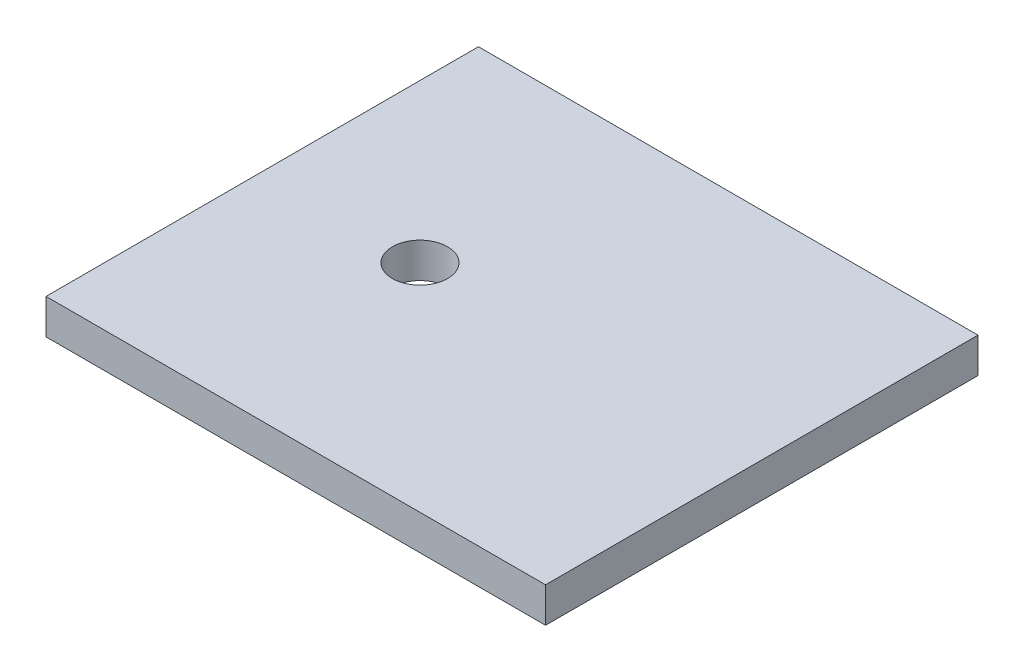
ISO-10303-21;
HEADER;
FILE_DESCRIPTION(('STEP AP214'),'2;1');
FILE_NAME('part.step','',(''),(''),'','','');
FILE_SCHEMA(('AUTOMOTIVE_DESIGN { 1 0 10303 214 1 1 1 1 }'));
ENDSEC;
DATA;
#1=APPLICATION_CONTEXT('core data for automotive mechanical design processes');
#2=APPLICATION_PROTOCOL_DEFINITION('international standard','automotive_design',2000,#1);
#3=PRODUCT_CONTEXT('',#1,'mechanical');
#4=PRODUCT('Part','Part','',(#3));
#5=PRODUCT_RELATED_PRODUCT_CATEGORY('part','',(#4));
#6=PRODUCT_DEFINITION_FORMATION('','',#4);
#7=PRODUCT_DEFINITION_CONTEXT('part definition',#1,'design');
#8=PRODUCT_DEFINITION('design','',#6,#7);
#9=PRODUCT_DEFINITION_SHAPE('','',#8);
#10=(LENGTH_UNIT() NAMED_UNIT(*) SI_UNIT(.MILLI.,.METRE.));
#11=(NAMED_UNIT(*) PLANE_ANGLE_UNIT() SI_UNIT($,.RADIAN.));
#12=(NAMED_UNIT(*) SI_UNIT($,.STERADIAN.) SOLID_ANGLE_UNIT());
#13=UNCERTAINTY_MEASURE_WITH_UNIT(LENGTH_MEASURE(1.E-05),#10,'distance_accuracy_value','');
#14=(GEOMETRIC_REPRESENTATION_CONTEXT(3) GLOBAL_UNCERTAINTY_ASSIGNED_CONTEXT((#13)) GLOBAL_UNIT_ASSIGNED_CONTEXT((#10,
#11,#12)) REPRESENTATION_CONTEXT('',''));
#15=CARTESIAN_POINT('',(0.,0.,0.));
#16=DIRECTION('',(0.,0.,1.));
#17=DIRECTION('',(1.,0.,0.));
#18=AXIS2_PLACEMENT_3D('',#15,#16,#17);
#19=CARTESIAN_POINT('',(0.,19.05,0.));
#20=DIRECTION('',(0.,-1.,0.));
#21=DIRECTION('',(0.,0.,-1.));
#22=AXIS2_PLACEMENT_3D('',#19,#20,#21);
#23=PLANE('',#22);
#24=DIRECTION('',(1.,0.,0.));
#25=VECTOR('',#24,1.);
#26=CARTESIAN_POINT('',(-85.725,19.05,117.5));
#27=LINE('',#26,#25);
#28=CARTESIAN_POINT('',(-85.725,19.05,117.5));
#29=VERTEX_POINT('',#28);
#30=CARTESIAN_POINT('',(185.725,19.05,117.5));
#31=VERTEX_POINT('',#30);
#32=EDGE_CURVE('E68',#29,#31,#27,.T.);
#33=ORIENTED_EDGE('',*,*,#32,.T.);
#34=DIRECTION('',(0.,0.,1.));
#35=VECTOR('',#34,1.);
#36=CARTESIAN_POINT('',(185.725,19.05,117.5));
#37=LINE('',#36,#35);
#38=CARTESIAN_POINT('',(185.725,19.05,-117.5));
#39=VERTEX_POINT('',#38);
#40=EDGE_CURVE('E100',#39,#31,#37,.T.);
#41=ORIENTED_EDGE('',*,*,#40,.F.);
#42=DIRECTION('',(-1.,0.,0.));
#43=VECTOR('',#42,1.);
#44=CARTESIAN_POINT('',(-85.725,19.05,-117.5));
#45=LINE('',#44,#43);
#46=CARTESIAN_POINT('',(-85.725,19.05,-117.5));
#47=VERTEX_POINT('',#46);
#48=EDGE_CURVE('E88',#39,#47,#45,.T.);
#49=ORIENTED_EDGE('',*,*,#48,.T.);
#50=DIRECTION('',(0.,0.,1.));
#51=VECTOR('',#50,1.);
#52=CARTESIAN_POINT('',(-85.725,19.05,117.5));
#53=LINE('',#52,#51);
#54=EDGE_CURVE('E52',#47,#29,#53,.T.);
#55=ORIENTED_EDGE('',*,*,#54,.T.);
#56=EDGE_LOOP('',(#33,#41,#49,#55));
#57=FACE_BOUND('',#56,.T.);
#58=CARTESIAN_POINT('',(0.,19.05,0.));
#59=DIRECTION('',(0.,1.,0.));
#60=DIRECTION('',(0.,0.,1.));
#61=AXIS2_PLACEMENT_3D('',#58,#59,#60);
#62=CIRCLE('',#61,15.);
#63=CARTESIAN_POINT('',(0.,19.05,-15.));
#64=VERTEX_POINT('',#63);
#65=EDGE_CURVE('E106',#64,#64,#62,.T.);
#66=ORIENTED_EDGE('',*,*,#65,.F.);
#67=EDGE_LOOP('',(#66));
#68=FACE_BOUND('',#67,.T.);
#69=ADVANCED_FACE('F35',(#57,#68),#23,.F.);
#70=CARTESIAN_POINT('',(0.,0.,0.));
#71=DIRECTION('',(0.,-1.,0.));
#72=DIRECTION('',(0.,0.,-1.));
#73=AXIS2_PLACEMENT_3D('',#70,#71,#72);
#74=PLANE('',#73);
#75=DIRECTION('',(-1.,0.,0.));
#76=VECTOR('',#75,1.);
#77=CARTESIAN_POINT('',(-85.725,0.,-117.5));
#78=LINE('',#77,#76);
#79=CARTESIAN_POINT('',(185.725,0.,-117.5));
#80=VERTEX_POINT('',#79);
#81=CARTESIAN_POINT('',(-85.725,0.,-117.5));
#82=VERTEX_POINT('',#81);
#83=EDGE_CURVE('E63',#80,#82,#78,.T.);
#84=ORIENTED_EDGE('',*,*,#83,.F.);
#85=DIRECTION('',(0.,0.,-1.));
#86=VECTOR('',#85,1.);
#87=CARTESIAN_POINT('',(185.725,0.,117.5));
#88=LINE('',#87,#86);
#89=CARTESIAN_POINT('',(185.725,0.,117.5));
#90=VERTEX_POINT('',#89);
#91=EDGE_CURVE('E92',#90,#80,#88,.T.);
#92=ORIENTED_EDGE('',*,*,#91,.F.);
#93=DIRECTION('',(1.,0.,0.));
#94=VECTOR('',#93,1.);
#95=CARTESIAN_POINT('',(-85.725,0.,117.5));
#96=LINE('',#95,#94);
#97=CARTESIAN_POINT('',(-85.725,0.,117.5));
#98=VERTEX_POINT('',#97);
#99=EDGE_CURVE('E81',#98,#90,#96,.T.);
#100=ORIENTED_EDGE('',*,*,#99,.F.);
#101=DIRECTION('',(0.,0.,1.));
#102=VECTOR('',#101,1.);
#103=CARTESIAN_POINT('',(-85.725,0.,117.5));
#104=LINE('',#103,#102);
#105=EDGE_CURVE('E89',#82,#98,#104,.T.);
#106=ORIENTED_EDGE('',*,*,#105,.F.);
#107=EDGE_LOOP('',(#84,#92,#100,#106));
#108=FACE_BOUND('',#107,.T.);
#109=CARTESIAN_POINT('',(0.,0.,0.));
#110=DIRECTION('',(0.,1.,0.));
#111=DIRECTION('',(0.,0.,1.));
#112=AXIS2_PLACEMENT_3D('',#109,#110,#111);
#113=CIRCLE('',#112,15.);
#114=CARTESIAN_POINT('',(0.,0.,-15.));
#115=VERTEX_POINT('',#114);
#116=EDGE_CURVE('E105',#115,#115,#113,.T.);
#117=ORIENTED_EDGE('',*,*,#116,.T.);
#118=EDGE_LOOP('',(#117));
#119=FACE_BOUND('',#118,.T.);
#120=ADVANCED_FACE('F93',(#108,#119),#74,.T.);
#121=CARTESIAN_POINT('',(-85.725,19.05,-117.5));
#122=DIRECTION('',(0.,0.,1.));
#123=DIRECTION('',(1.,0.,0.));
#124=AXIS2_PLACEMENT_3D('',#121,#122,#123);
#125=PLANE('',#124);
#126=ORIENTED_EDGE('',*,*,#83,.T.);
#127=DIRECTION('',(0.,-1.,0.));
#128=VECTOR('',#127,1.);
#129=CARTESIAN_POINT('',(-85.725,19.05,-117.5));
#130=LINE('',#129,#128);
#131=EDGE_CURVE('E11',#47,#82,#130,.T.);
#132=ORIENTED_EDGE('',*,*,#131,.F.);
#133=ORIENTED_EDGE('',*,*,#48,.F.);
#134=DIRECTION('',(0.,1.,0.));
#135=VECTOR('',#134,1.);
#136=CARTESIAN_POINT('',(185.725,0.,-117.5));
#137=LINE('',#136,#135);
#138=EDGE_CURVE('E97',#80,#39,#137,.T.);
#139=ORIENTED_EDGE('',*,*,#138,.F.);
#140=EDGE_LOOP('',(#126,#132,#133,#139));
#141=FACE_BOUND('',#140,.T.);
#142=ADVANCED_FACE('F37',(#141),#125,.F.);
#143=CARTESIAN_POINT('',(-85.725,19.05,117.5));
#144=DIRECTION('',(1.,0.,0.));
#145=DIRECTION('',(0.,0.,-1.));
#146=AXIS2_PLACEMENT_3D('',#143,#144,#145);
#147=PLANE('',#146);
#148=ORIENTED_EDGE('',*,*,#105,.T.);
#149=DIRECTION('',(0.,-1.,0.));
#150=VECTOR('',#149,1.);
#151=CARTESIAN_POINT('',(-85.725,19.05,117.5));
#152=LINE('',#151,#150);
#153=EDGE_CURVE('E44',#29,#98,#152,.T.);
#154=ORIENTED_EDGE('',*,*,#153,.F.);
#155=ORIENTED_EDGE('',*,*,#54,.F.);
#156=ORIENTED_EDGE('',*,*,#131,.T.);
#157=EDGE_LOOP('',(#148,#154,#155,#156));
#158=FACE_BOUND('',#157,.T.);
#159=ADVANCED_FACE('F116',(#158),#147,.F.);
#160=CARTESIAN_POINT('',(-85.725,19.05,117.5));
#161=DIRECTION('',(0.,0.,-1.));
#162=DIRECTION('',(-1.,0.,0.));
#163=AXIS2_PLACEMENT_3D('',#160,#161,#162);
#164=PLANE('',#163);
#165=ORIENTED_EDGE('',*,*,#99,.T.);
#166=DIRECTION('',(0.,-1.,0.));
#167=VECTOR('',#166,1.);
#168=CARTESIAN_POINT('',(185.725,0.,117.5));
#169=LINE('',#168,#167);
#170=EDGE_CURVE('E85',#31,#90,#169,.T.);
#171=ORIENTED_EDGE('',*,*,#170,.F.);
#172=ORIENTED_EDGE('',*,*,#32,.F.);
#173=ORIENTED_EDGE('',*,*,#153,.T.);
#174=EDGE_LOOP('',(#165,#171,#172,#173));
#175=FACE_BOUND('',#174,.T.);
#176=ADVANCED_FACE('F83',(#175),#164,.F.);
#177=CARTESIAN_POINT('',(0.,19.05,0.));
#178=DIRECTION('',(0.,-1.,0.));
#179=DIRECTION('',(0.,0.,-1.));
#180=AXIS2_PLACEMENT_3D('',#177,#178,#179);
#181=CYLINDRICAL_SURFACE('',#180,15.);
#182=CARTESIAN_POINT('',(0.,19.05,-15.));
#183=CARTESIAN_POINT('',(0.,18.8515625,-15.));
#184=CARTESIAN_POINT('',(0.,18.653125,-15.));
#185=CARTESIAN_POINT('',(0.,18.25625,-15.));
#186=CARTESIAN_POINT('',(0.,18.0578125,-15.));
#187=CARTESIAN_POINT('',(0.,17.6609375,-15.));
#188=CARTESIAN_POINT('',(0.,17.4625,-15.));
#189=CARTESIAN_POINT('',(0.,17.065625,-15.));
#190=CARTESIAN_POINT('',(0.,16.8671875,-15.));
#191=CARTESIAN_POINT('',(0.,16.4703125,-15.));
#192=CARTESIAN_POINT('',(0.,16.271875,-15.));
#193=CARTESIAN_POINT('',(0.,15.875,-15.));
#194=CARTESIAN_POINT('',(0.,15.6765625,-15.));
#195=CARTESIAN_POINT('',(0.,15.2796875,-15.));
#196=CARTESIAN_POINT('',(0.,15.08125,-15.));
#197=CARTESIAN_POINT('',(0.,14.684375,-15.));
#198=CARTESIAN_POINT('',(0.,14.4859375,-15.));
#199=CARTESIAN_POINT('',(0.,14.0890625,-15.));
#200=CARTESIAN_POINT('',(0.,13.890625,-15.));
#201=CARTESIAN_POINT('',(0.,13.49375,-15.));
#202=CARTESIAN_POINT('',(0.,13.2953125,-15.));
#203=CARTESIAN_POINT('',(0.,12.8984375,-15.));
#204=CARTESIAN_POINT('',(0.,12.7,-15.));
#205=CARTESIAN_POINT('',(0.,12.303125,-15.));
#206=CARTESIAN_POINT('',(0.,12.1046875,-15.));
#207=CARTESIAN_POINT('',(0.,11.7078125,-15.));
#208=CARTESIAN_POINT('',(0.,11.509375,-15.));
#209=CARTESIAN_POINT('',(0.,11.1125,-15.));
#210=CARTESIAN_POINT('',(0.,10.9140625,-15.));
#211=CARTESIAN_POINT('',(0.,10.5171875,-15.));
#212=CARTESIAN_POINT('',(0.,10.31875,-15.));
#213=CARTESIAN_POINT('',(0.,9.921875,-15.));
#214=CARTESIAN_POINT('',(0.,9.7234375,-15.));
#215=CARTESIAN_POINT('',(0.,9.3265625,-15.));
#216=CARTESIAN_POINT('',(0.,9.128125,-15.));
#217=CARTESIAN_POINT('',(0.,8.73125,-15.));
#218=CARTESIAN_POINT('',(0.,8.5328125,-15.));
#219=CARTESIAN_POINT('',(0.,8.1359375,-15.));
#220=CARTESIAN_POINT('',(0.,7.9375,-15.));
#221=CARTESIAN_POINT('',(0.,7.540625,-15.));
#222=CARTESIAN_POINT('',(0.,7.3421875,-15.));
#223=CARTESIAN_POINT('',(0.,6.9453125,-15.));
#224=CARTESIAN_POINT('',(0.,6.746875,-15.));
#225=CARTESIAN_POINT('',(0.,6.35,-15.));
#226=CARTESIAN_POINT('',(0.,6.1515625,-15.));
#227=CARTESIAN_POINT('',(0.,5.7546875,-15.));
#228=CARTESIAN_POINT('',(0.,5.55625,-15.));
#229=CARTESIAN_POINT('',(0.,5.159375,-15.));
#230=CARTESIAN_POINT('',(0.,4.9609375,-15.));
#231=CARTESIAN_POINT('',(0.,4.5640625,-15.));
#232=CARTESIAN_POINT('',(0.,4.365625,-15.));
#233=CARTESIAN_POINT('',(0.,3.96875,-15.));
#234=CARTESIAN_POINT('',(0.,3.7703125,-15.));
#235=CARTESIAN_POINT('',(0.,3.3734375,-15.));
#236=CARTESIAN_POINT('',(0.,3.175,-15.));
#237=CARTESIAN_POINT('',(0.,2.778125,-15.));
#238=CARTESIAN_POINT('',(0.,2.5796875,-15.));
#239=CARTESIAN_POINT('',(0.,2.1828125,-15.));
#240=CARTESIAN_POINT('',(0.,1.984375,-15.));
#241=CARTESIAN_POINT('',(0.,1.5875,-15.));
#242=CARTESIAN_POINT('',(0.,1.3890625,-15.));
#243=CARTESIAN_POINT('',(0.,0.992187500000001,-15.));
#244=CARTESIAN_POINT('',(0.,0.793750000000001,-15.));
#245=CARTESIAN_POINT('',(0.,0.396875,-15.));
#246=CARTESIAN_POINT('',(0.,0.1984375,-15.));
#247=CARTESIAN_POINT('',(0.,0.,-15.));
#248=B_SPLINE_CURVE_WITH_KNOTS('',3,(#182,#183,#184,#185,#186,#187,#188,#189,#190,#191,#192,
#193,#194,#195,#196,#197,#198,#199,#200,#201,#202,#203,#204,#205,#206,#207,#208,#209,#210,#211,
#212,#213,#214,#215,#216,#217,#218,#219,#220,#221,#222,#223,#224,#225,#226,#227,#228,#229,#230,
#231,#232,#233,#234,#235,#236,#237,#238,#239,#240,#241,#242,#243,#244,#245,#246,#247),
.UNSPECIFIED.,.F.,.F.,(4,2,2,2,2,2,2,2,2,2,2,2,2,2,2,2,2,2,2,2,2,2,2,2,2,2,2,2,2,2,2,2,4),(0.,
0.5953125,1.190625,1.7859375,2.38125,2.9765625,3.571875,4.1671875,4.7625,5.3578125,5.953125,
6.5484375,7.14375,7.7390625,8.334375,8.9296875,9.525,10.1203125,10.715625,11.3109375,11.90625,
12.5015625,13.096875,13.6921875,14.2875,14.8828125,15.478125,16.0734375,16.66875,17.2640625,
17.859375,18.4546875,19.05),.UNSPECIFIED.);
#249=EDGE_CURVE('BSEAM122',#64,#115,#248,.T.);
#250=ORIENTED_EDGE('',*,*,#65,.T.);
#251=ORIENTED_EDGE('',*,*,#116,.F.);
#252=ORIENTED_EDGE('',*,*,#249,.T.);
#253=ORIENTED_EDGE('',*,*,#249,.F.);
#254=EDGE_LOOP('',(#250,#252,#251,#253));
#255=FACE_BOUND('',#254,.T.);
#256=ADVANCED_FACE('F122',(#255),#181,.F.);
#257=CARTESIAN_POINT('',(185.725,0.,0.));
#258=DIRECTION('',(-1.,0.,0.));
#259=DIRECTION('',(0.,0.,1.));
#260=AXIS2_PLACEMENT_3D('',#257,#258,#259);
#261=PLANE('',#260);
#262=ORIENTED_EDGE('',*,*,#170,.T.);
#263=ORIENTED_EDGE('',*,*,#91,.T.);
#264=ORIENTED_EDGE('',*,*,#138,.T.);
#265=ORIENTED_EDGE('',*,*,#40,.T.);
#266=EDGE_LOOP('',(#262,#263,#264,#265));
#267=FACE_BOUND('',#266,.T.);
#268=ADVANCED_FACE('F99',(#267),#261,.F.);
#269=CLOSED_SHELL('',(#69,#120,#142,#159,#176,#256,#268));
#270=MANIFOLD_SOLID_BREP('B2',#269);
#271=ADVANCED_BREP_SHAPE_REPRESENTATION('',(#18,#270),#14);
#272=SHAPE_DEFINITION_REPRESENTATION(#9,#271);
ENDSEC;
END-ISO-10303-21;
